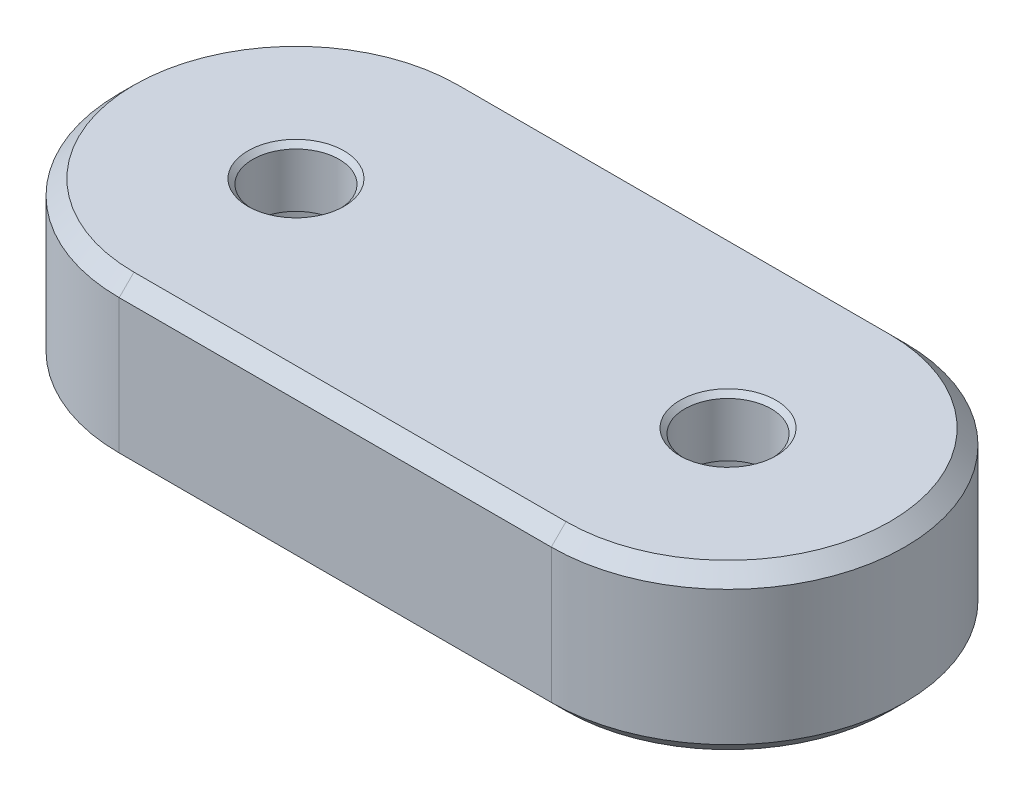
ISO-10303-21;
HEADER;
FILE_DESCRIPTION(('STEP AP214'),'2;1');
FILE_NAME('part.step','',(''),(''),'','','');
FILE_SCHEMA(('AUTOMOTIVE_DESIGN { 1 0 10303 214 1 1 1 1 }'));
ENDSEC;
DATA;
#1=APPLICATION_CONTEXT('core data for automotive mechanical design processes');
#2=APPLICATION_PROTOCOL_DEFINITION('international standard','automotive_design',2000,#1);
#3=PRODUCT_CONTEXT('',#1,'mechanical');
#4=PRODUCT('Part','Part','',(#3));
#5=PRODUCT_RELATED_PRODUCT_CATEGORY('part','',(#4));
#6=PRODUCT_DEFINITION_FORMATION('','',#4);
#7=PRODUCT_DEFINITION_CONTEXT('part definition',#1,'design');
#8=PRODUCT_DEFINITION('design','',#6,#7);
#9=PRODUCT_DEFINITION_SHAPE('','',#8);
#10=(LENGTH_UNIT() NAMED_UNIT(*) SI_UNIT(.MILLI.,.METRE.));
#11=(NAMED_UNIT(*) PLANE_ANGLE_UNIT() SI_UNIT($,.RADIAN.));
#12=(NAMED_UNIT(*) SI_UNIT($,.STERADIAN.) SOLID_ANGLE_UNIT());
#13=UNCERTAINTY_MEASURE_WITH_UNIT(LENGTH_MEASURE(1.E-05),#10,'distance_accuracy_value','');
#14=(GEOMETRIC_REPRESENTATION_CONTEXT(3) GLOBAL_UNCERTAINTY_ASSIGNED_CONTEXT((#13)) GLOBAL_UNIT_ASSIGNED_CONTEXT((#10,
#11,#12)) REPRESENTATION_CONTEXT('',''));
#15=CARTESIAN_POINT('',(0.,0.,0.));
#16=DIRECTION('',(0.,0.,1.));
#17=DIRECTION('',(1.,0.,0.));
#18=AXIS2_PLACEMENT_3D('',#15,#16,#17);
#19=CARTESIAN_POINT('',(0.,-5.35,9.));
#20=DIRECTION('',(0.,0.,1.));
#21=DIRECTION('',(1.,0.,0.));
#22=AXIS2_PLACEMENT_3D('',#19,#20,#21);
#23=PLANE('',#22);
#24=DIRECTION('',(0.,1.,0.));
#25=VECTOR('',#24,1.);
#26=CARTESIAN_POINT('',(0.,-5.35,9.));
#27=LINE('',#26,#25);
#28=CARTESIAN_POINT('',(0.,-4.59999999999999,9.));
#29=VERTEX_POINT('',#28);
#30=CARTESIAN_POINT('',(0.,2.24999999999999,9.));
#31=VERTEX_POINT('',#30);
#32=EDGE_CURVE('E135',#29,#31,#27,.T.);
#33=ORIENTED_EDGE('',*,*,#32,.F.);
#34=DIRECTION('',(1.,0.,0.));
#35=VECTOR('',#34,1.);
#36=CARTESIAN_POINT('',(22.,-4.59999999999999,9.));
#37=LINE('',#36,#35);
#38=CARTESIAN_POINT('',(22.,-4.59999999999999,9.));
#39=VERTEX_POINT('',#38);
#40=EDGE_CURVE('E265',#29,#39,#37,.T.);
#41=ORIENTED_EDGE('',*,*,#40,.T.);
#42=DIRECTION('',(0.,1.,0.));
#43=VECTOR('',#42,1.);
#44=CARTESIAN_POINT('',(22.,-5.35,9.));
#45=LINE('',#44,#43);
#46=CARTESIAN_POINT('',(22.,2.24999999999999,9.));
#47=VERTEX_POINT('',#46);
#48=EDGE_CURVE('E205',#39,#47,#45,.T.);
#49=ORIENTED_EDGE('',*,*,#48,.T.);
#50=DIRECTION('',(-1.,0.,0.));
#51=VECTOR('',#50,1.);
#52=CARTESIAN_POINT('',(0.,2.24999999999999,9.));
#53=LINE('',#52,#51);
#54=EDGE_CURVE('E262',#47,#31,#53,.T.);
#55=ORIENTED_EDGE('',*,*,#54,.T.);
#56=EDGE_LOOP('',(#33,#41,#49,#55));
#57=FACE_BOUND('',#56,.T.);
#58=ADVANCED_FACE('F43',(#57),#23,.T.);
#59=CARTESIAN_POINT('',(0.,-5.35,0.));
#60=DIRECTION('',(0.,1.,0.));
#61=DIRECTION('',(0.,0.,1.));
#62=AXIS2_PLACEMENT_3D('',#59,#60,#61);
#63=CYLINDRICAL_SURFACE('',#62,9.);
#64=DIRECTION('',(0.,1.,0.));
#65=VECTOR('',#64,1.);
#66=CARTESIAN_POINT('',(0.,-5.35,-9.));
#67=LINE('',#66,#65);
#68=CARTESIAN_POINT('',(0.,-4.59999999999999,-9.));
#69=VERTEX_POINT('',#68);
#70=CARTESIAN_POINT('',(0.,2.24999999999999,-9.));
#71=VERTEX_POINT('',#70);
#72=EDGE_CURVE('E212',#69,#71,#67,.T.);
#73=ORIENTED_EDGE('',*,*,#72,.F.);
#74=CARTESIAN_POINT('',(0.,-4.59999999999999,0.));
#75=DIRECTION('',(0.,1.,0.));
#76=DIRECTION('',(0.,0.,1.));
#77=AXIS2_PLACEMENT_3D('',#74,#75,#76);
#78=CIRCLE('',#77,9.);
#79=EDGE_CURVE('E254',#69,#29,#78,.T.);
#80=ORIENTED_EDGE('',*,*,#79,.T.);
#81=ORIENTED_EDGE('',*,*,#32,.T.);
#82=CARTESIAN_POINT('',(0.,2.24999999999999,0.));
#83=DIRECTION('',(0.,1.,0.));
#84=DIRECTION('',(0.,0.,1.));
#85=AXIS2_PLACEMENT_3D('',#82,#83,#84);
#86=CIRCLE('',#85,9.);
#87=EDGE_CURVE('E251',#31,#71,#86,.F.);
#88=ORIENTED_EDGE('',*,*,#87,.T.);
#89=EDGE_LOOP('',(#73,#80,#81,#88));
#90=FACE_BOUND('',#89,.T.);
#91=ADVANCED_FACE('F288',(#90),#63,.T.);
#92=CARTESIAN_POINT('',(0.,-5.35,-9.));
#93=DIRECTION('',(0.,0.,1.));
#94=DIRECTION('',(1.,0.,0.));
#95=AXIS2_PLACEMENT_3D('',#92,#93,#94);
#96=PLANE('',#95);
#97=DIRECTION('',(0.,1.,0.));
#98=VECTOR('',#97,1.);
#99=CARTESIAN_POINT('',(22.,-5.35,-9.));
#100=LINE('',#99,#98);
#101=CARTESIAN_POINT('',(22.,-4.59999999999999,-9.));
#102=VERTEX_POINT('',#101);
#103=CARTESIAN_POINT('',(22.,2.24999999999999,-9.));
#104=VERTEX_POINT('',#103);
#105=EDGE_CURVE('E216',#102,#104,#100,.T.);
#106=ORIENTED_EDGE('',*,*,#105,.F.);
#107=DIRECTION('',(-1.,0.,0.));
#108=VECTOR('',#107,1.);
#109=CARTESIAN_POINT('',(0.,-4.59999999999999,-9.));
#110=LINE('',#109,#108);
#111=EDGE_CURVE('E247',#102,#69,#110,.T.);
#112=ORIENTED_EDGE('',*,*,#111,.T.);
#113=ORIENTED_EDGE('',*,*,#72,.T.);
#114=DIRECTION('',(1.,0.,0.));
#115=VECTOR('',#114,1.);
#116=CARTESIAN_POINT('',(22.,2.24999999999999,-9.));
#117=LINE('',#116,#115);
#118=EDGE_CURVE('E243',#71,#104,#117,.T.);
#119=ORIENTED_EDGE('',*,*,#118,.T.);
#120=EDGE_LOOP('',(#106,#112,#113,#119));
#121=FACE_BOUND('',#120,.T.);
#122=ADVANCED_FACE('F286',(#121),#96,.F.);
#123=CARTESIAN_POINT('',(0.,-5.35,0.));
#124=DIRECTION('',(0.,1.,0.));
#125=DIRECTION('',(0.,0.,1.));
#126=AXIS2_PLACEMENT_3D('',#123,#124,#125);
#127=CYLINDRICAL_SURFACE('',#126,4.6);
#128=CARTESIAN_POINT('',(0.,-4.6,0.));
#129=DIRECTION('',(0.,1.,0.));
#130=DIRECTION('',(0.,0.,1.));
#131=AXIS2_PLACEMENT_3D('',#128,#129,#130);
#132=CIRCLE('',#131,4.6);
#133=CARTESIAN_POINT('',(0.,-4.6,4.6));
#134=VERTEX_POINT('',#133);
#135=EDGE_CURVE('E239',#134,#134,#132,.F.);
#136=ORIENTED_EDGE('',*,*,#135,.T.);
#137=EDGE_LOOP('',(#136));
#138=FACE_BOUND('',#137,.T.);
#139=CARTESIAN_POINT('',(0.,0.,0.));
#140=DIRECTION('',(0.,1.,0.));
#141=DIRECTION('',(0.,0.,1.));
#142=AXIS2_PLACEMENT_3D('',#139,#140,#141);
#143=CIRCLE('',#142,4.6);
#144=CARTESIAN_POINT('',(0.,0.,4.6));
#145=VERTEX_POINT('',#144);
#146=EDGE_CURVE('E198',#145,#145,#143,.T.);
#147=ORIENTED_EDGE('',*,*,#146,.T.);
#148=EDGE_LOOP('',(#147));
#149=FACE_BOUND('',#148,.T.);
#150=ADVANCED_FACE('F325',(#138,#149),#127,.F.);
#151=CARTESIAN_POINT('',(22.,-5.35,0.));
#152=DIRECTION('',(0.,1.,0.));
#153=DIRECTION('',(0.,0.,1.));
#154=AXIS2_PLACEMENT_3D('',#151,#152,#153);
#155=CYLINDRICAL_SURFACE('',#154,4.6);
#156=CARTESIAN_POINT('',(22.,-4.59999999999999,0.));
#157=DIRECTION('',(0.,1.,0.));
#158=DIRECTION('',(0.,0.,1.));
#159=AXIS2_PLACEMENT_3D('',#156,#157,#158);
#160=CIRCLE('',#159,4.6);
#161=CARTESIAN_POINT('',(22.,-4.59999999999999,4.6));
#162=VERTEX_POINT('',#161);
#163=EDGE_CURVE('E235',#162,#162,#160,.F.);
#164=ORIENTED_EDGE('',*,*,#163,.T.);
#165=EDGE_LOOP('',(#164));
#166=FACE_BOUND('',#165,.T.);
#167=CARTESIAN_POINT('',(22.,0.,0.));
#168=DIRECTION('',(0.,1.,0.));
#169=DIRECTION('',(0.,0.,1.));
#170=AXIS2_PLACEMENT_3D('',#167,#168,#169);
#171=CIRCLE('',#170,4.6);
#172=CARTESIAN_POINT('',(22.,0.,4.6));
#173=VERTEX_POINT('',#172);
#174=EDGE_CURVE('E201',#173,#173,#171,.T.);
#175=ORIENTED_EDGE('',*,*,#174,.T.);
#176=EDGE_LOOP('',(#175));
#177=FACE_BOUND('',#176,.T.);
#178=ADVANCED_FACE('F328',(#166,#177),#155,.F.);
#179=CARTESIAN_POINT('',(22.,-5.35,0.));
#180=DIRECTION('',(0.,1.,0.));
#181=DIRECTION('',(0.,0.,1.));
#182=AXIS2_PLACEMENT_3D('',#179,#180,#181);
#183=CYLINDRICAL_SURFACE('',#182,9.);
#184=ORIENTED_EDGE('',*,*,#48,.F.);
#185=CARTESIAN_POINT('',(22.,-4.59999999999999,0.));
#186=DIRECTION('',(0.,1.,0.));
#187=DIRECTION('',(0.,0.,1.));
#188=AXIS2_PLACEMENT_3D('',#185,#186,#187);
#189=CIRCLE('',#188,9.);
#190=EDGE_CURVE('E138',#39,#102,#189,.T.);
#191=ORIENTED_EDGE('',*,*,#190,.T.);
#192=ORIENTED_EDGE('',*,*,#105,.T.);
#193=CARTESIAN_POINT('',(22.,2.24999999999999,0.));
#194=DIRECTION('',(0.,1.,0.));
#195=DIRECTION('',(0.,0.,1.));
#196=AXIS2_PLACEMENT_3D('',#193,#194,#195);
#197=CIRCLE('',#196,9.);
#198=EDGE_CURVE('E257',#104,#47,#197,.F.);
#199=ORIENTED_EDGE('',*,*,#198,.T.);
#200=EDGE_LOOP('',(#184,#191,#192,#199));
#201=FACE_BOUND('',#200,.T.);
#202=ADVANCED_FACE('F298',(#201),#183,.T.);
#203=CARTESIAN_POINT('',(0.,-5.35,0.));
#204=DIRECTION('',(0.,1.,0.));
#205=DIRECTION('',(0.,0.,1.));
#206=AXIS2_PLACEMENT_3D('',#203,#204,#205);
#207=PLANE('',#206);
#208=CARTESIAN_POINT('',(22.,-5.35,0.));
#209=DIRECTION('',(0.,1.,0.));
#210=DIRECTION('',(0.,0.,1.));
#211=AXIS2_PLACEMENT_3D('',#208,#209,#210);
#212=CIRCLE('',#211,5.35);
#213=CARTESIAN_POINT('',(22.,-5.35,5.35));
#214=VERTEX_POINT('',#213);
#215=EDGE_CURVE('E231',#214,#214,#212,.T.);
#216=ORIENTED_EDGE('',*,*,#215,.T.);
#217=EDGE_LOOP('',(#216));
#218=FACE_BOUND('',#217,.T.);
#219=CARTESIAN_POINT('',(0.,-5.35,0.));
#220=DIRECTION('',(0.,1.,0.));
#221=DIRECTION('',(0.,0.,1.));
#222=AXIS2_PLACEMENT_3D('',#219,#220,#221);
#223=CIRCLE('',#222,5.35);
#224=CARTESIAN_POINT('',(0.,-5.35,5.35));
#225=VERTEX_POINT('',#224);
#226=EDGE_CURVE('E227',#225,#225,#223,.T.);
#227=ORIENTED_EDGE('',*,*,#226,.T.);
#228=EDGE_LOOP('',(#227));
#229=FACE_BOUND('',#228,.T.);
#230=CARTESIAN_POINT('',(0.,-5.35,0.));
#231=DIRECTION('',(0.,1.,0.));
#232=DIRECTION('',(0.,0.,1.));
#233=AXIS2_PLACEMENT_3D('',#230,#231,#232);
#234=CIRCLE('',#233,8.24999999999999);
#235=CARTESIAN_POINT('',(0.,-5.35,8.24999999999999));
#236=VERTEX_POINT('',#235);
#237=CARTESIAN_POINT('',(0.,-5.35,-8.24999999999999));
#238=VERTEX_POINT('',#237);
#239=EDGE_CURVE('E123',#236,#238,#234,.F.);
#240=ORIENTED_EDGE('',*,*,#239,.T.);
#241=DIRECTION('',(1.,0.,0.));
#242=VECTOR('',#241,1.);
#243=CARTESIAN_POINT('',(0.,-5.35,-8.24999999999999));
#244=LINE('',#243,#242);
#245=CARTESIAN_POINT('',(22.,-5.35,-8.24999999999999));
#246=VERTEX_POINT('',#245);
#247=EDGE_CURVE('E118',#238,#246,#244,.T.);
#248=ORIENTED_EDGE('',*,*,#247,.T.);
#249=CARTESIAN_POINT('',(22.,-5.35,0.));
#250=DIRECTION('',(0.,1.,0.));
#251=DIRECTION('',(0.,0.,1.));
#252=AXIS2_PLACEMENT_3D('',#249,#250,#251);
#253=CIRCLE('',#252,8.24999999999999);
#254=CARTESIAN_POINT('',(22.,-5.35,8.24999999999999));
#255=VERTEX_POINT('',#254);
#256=EDGE_CURVE('E112',#246,#255,#253,.F.);
#257=ORIENTED_EDGE('',*,*,#256,.T.);
#258=DIRECTION('',(-1.,0.,0.));
#259=VECTOR('',#258,1.);
#260=CARTESIAN_POINT('',(0.,-5.35,8.24999999999999));
#261=LINE('',#260,#259);
#262=EDGE_CURVE('E115',#255,#236,#261,.T.);
#263=ORIENTED_EDGE('',*,*,#262,.T.);
#264=EDGE_LOOP('',(#240,#248,#257,#263));
#265=FACE_BOUND('',#264,.T.);
#266=ADVANCED_FACE('F114',(#218,#229,#265),#207,.F.);
#267=CARTESIAN_POINT('',(0.,0.,0.));
#268=DIRECTION('',(0.,1.,0.));
#269=DIRECTION('',(0.,0.,1.));
#270=AXIS2_PLACEMENT_3D('',#267,#268,#269);
#271=PLANE('',#270);
#272=CARTESIAN_POINT('',(22.,0.,0.));
#273=DIRECTION('',(0.,1.,0.));
#274=DIRECTION('',(0.,0.,1.));
#275=AXIS2_PLACEMENT_3D('',#272,#273,#274);
#276=CIRCLE('',#275,2.19999999999999);
#277=CARTESIAN_POINT('',(22.,0.,2.19999999999999));
#278=VERTEX_POINT('',#277);
#279=EDGE_CURVE('E144',#278,#278,#276,.T.);
#280=ORIENTED_EDGE('',*,*,#279,.T.);
#281=EDGE_LOOP('',(#280));
#282=FACE_BOUND('',#281,.T.);
#283=ORIENTED_EDGE('',*,*,#174,.F.);
#284=EDGE_LOOP('',(#283));
#285=FACE_BOUND('',#284,.T.);
#286=ADVANCED_FACE('F457',(#282,#285),#271,.F.);
#287=CARTESIAN_POINT('',(0.,0.,0.));
#288=DIRECTION('',(0.,1.,0.));
#289=DIRECTION('',(0.,0.,1.));
#290=AXIS2_PLACEMENT_3D('',#287,#288,#289);
#291=CIRCLE('',#290,2.2);
#292=CARTESIAN_POINT('',(0.,0.,2.2));
#293=VERTEX_POINT('',#292);
#294=EDGE_CURVE('E194',#293,#293,#291,.T.);
#295=ORIENTED_EDGE('',*,*,#294,.T.);
#296=EDGE_LOOP('',(#295));
#297=FACE_BOUND('',#296,.T.);
#298=ORIENTED_EDGE('',*,*,#146,.F.);
#299=EDGE_LOOP('',(#298));
#300=FACE_BOUND('',#299,.T.);
#301=ADVANCED_FACE('F188',(#297,#300),#271,.F.);
#302=CARTESIAN_POINT('',(22.,3.,0.));
#303=DIRECTION('',(0.,-1.,0.));
#304=DIRECTION('',(0.,0.,-1.));
#305=AXIS2_PLACEMENT_3D('',#302,#303,#304);
#306=CYLINDRICAL_SURFACE('',#305,2.19999999999999);
#307=CARTESIAN_POINT('',(22.,2.75000000000001,0.));
#308=DIRECTION('',(0.,1.,0.));
#309=DIRECTION('',(0.,0.,1.));
#310=AXIS2_PLACEMENT_3D('',#307,#308,#309);
#311=CIRCLE('',#310,2.19999999999999);
#312=CARTESIAN_POINT('',(22.,2.75000000000001,2.19999999999999));
#313=VERTEX_POINT('',#312);
#314=EDGE_CURVE('E163',#313,#313,#311,.T.);
#315=ORIENTED_EDGE('',*,*,#314,.T.);
#316=EDGE_LOOP('',(#315));
#317=FACE_BOUND('',#316,.T.);
#318=ORIENTED_EDGE('',*,*,#279,.F.);
#319=EDGE_LOOP('',(#318));
#320=FACE_BOUND('',#319,.T.);
#321=ADVANCED_FACE('F184',(#317,#320),#306,.F.);
#322=CARTESIAN_POINT('',(0.,3.,0.));
#323=DIRECTION('',(0.,-1.,0.));
#324=DIRECTION('',(0.,0.,-1.));
#325=AXIS2_PLACEMENT_3D('',#322,#323,#324);
#326=CYLINDRICAL_SURFACE('',#325,2.2);
#327=CARTESIAN_POINT('',(0.,2.75,0.));
#328=DIRECTION('',(0.,1.,0.));
#329=DIRECTION('',(0.,0.,1.));
#330=AXIS2_PLACEMENT_3D('',#327,#328,#329);
#331=CIRCLE('',#330,2.2);
#332=CARTESIAN_POINT('',(0.,2.75,2.2));
#333=VERTEX_POINT('',#332);
#334=EDGE_CURVE('E11',#333,#333,#331,.T.);
#335=ORIENTED_EDGE('',*,*,#334,.T.);
#336=EDGE_LOOP('',(#335));
#337=FACE_BOUND('',#336,.T.);
#338=ORIENTED_EDGE('',*,*,#294,.F.);
#339=EDGE_LOOP('',(#338));
#340=FACE_BOUND('',#339,.T.);
#341=ADVANCED_FACE('F187',(#337,#340),#326,.F.);
#342=CARTESIAN_POINT('',(0.,3.,0.));
#343=DIRECTION('',(0.,1.,0.));
#344=DIRECTION('',(0.,0.,1.));
#345=AXIS2_PLACEMENT_3D('',#342,#343,#344);
#346=PLANE('',#345);
#347=CARTESIAN_POINT('',(22.,3.,0.));
#348=DIRECTION('',(0.,1.,0.));
#349=DIRECTION('',(0.,0.,1.));
#350=AXIS2_PLACEMENT_3D('',#347,#348,#349);
#351=CIRCLE('',#350,2.44999999999999);
#352=CARTESIAN_POINT('',(22.,3.,2.44999999999999));
#353=VERTEX_POINT('',#352);
#354=EDGE_CURVE('E53',#353,#353,#351,.F.);
#355=ORIENTED_EDGE('',*,*,#354,.T.);
#356=EDGE_LOOP('',(#355));
#357=FACE_BOUND('',#356,.T.);
#358=CARTESIAN_POINT('',(0.,3.,0.));
#359=DIRECTION('',(0.,1.,0.));
#360=DIRECTION('',(0.,0.,1.));
#361=AXIS2_PLACEMENT_3D('',#358,#359,#360);
#362=CIRCLE('',#361,2.45);
#363=CARTESIAN_POINT('',(0.,3.,2.45));
#364=VERTEX_POINT('',#363);
#365=EDGE_CURVE('E167',#364,#364,#362,.F.);
#366=ORIENTED_EDGE('',*,*,#365,.T.);
#367=EDGE_LOOP('',(#366));
#368=FACE_BOUND('',#367,.T.);
#369=CARTESIAN_POINT('',(22.,3.,0.));
#370=DIRECTION('',(0.,1.,0.));
#371=DIRECTION('',(0.,0.,1.));
#372=AXIS2_PLACEMENT_3D('',#369,#370,#371);
#373=CIRCLE('',#372,8.24999999999999);
#374=CARTESIAN_POINT('',(22.,3.,8.24999999999999));
#375=VERTEX_POINT('',#374);
#376=CARTESIAN_POINT('',(22.,3.,-8.24999999999999));
#377=VERTEX_POINT('',#376);
#378=EDGE_CURVE('E68',#375,#377,#373,.T.);
#379=ORIENTED_EDGE('',*,*,#378,.T.);
#380=DIRECTION('',(-1.,0.,0.));
#381=VECTOR('',#380,1.);
#382=CARTESIAN_POINT('',(0.,3.,-8.24999999999999));
#383=LINE('',#382,#381);
#384=CARTESIAN_POINT('',(0.,3.,-8.24999999999999));
#385=VERTEX_POINT('',#384);
#386=EDGE_CURVE('E168',#377,#385,#383,.T.);
#387=ORIENTED_EDGE('',*,*,#386,.T.);
#388=CARTESIAN_POINT('',(0.,3.,0.));
#389=DIRECTION('',(0.,1.,0.));
#390=DIRECTION('',(0.,0.,1.));
#391=AXIS2_PLACEMENT_3D('',#388,#389,#390);
#392=CIRCLE('',#391,8.24999999999999);
#393=CARTESIAN_POINT('',(0.,3.,8.24999999999999));
#394=VERTEX_POINT('',#393);
#395=EDGE_CURVE('E273',#385,#394,#392,.T.);
#396=ORIENTED_EDGE('',*,*,#395,.T.);
#397=DIRECTION('',(1.,0.,0.));
#398=VECTOR('',#397,1.);
#399=CARTESIAN_POINT('',(0.,3.,8.24999999999999));
#400=LINE('',#399,#398);
#401=EDGE_CURVE('E268',#394,#375,#400,.T.);
#402=ORIENTED_EDGE('',*,*,#401,.T.);
#403=EDGE_LOOP('',(#379,#387,#396,#402));
#404=FACE_BOUND('',#403,.T.);
#405=ADVANCED_FACE('F175',(#357,#368,#404),#346,.T.);
#406=CARTESIAN_POINT('',(22.,-5.35,0.));
#407=DIRECTION('',(0.,-1.,0.));
#408=DIRECTION('',(0.,0.,-1.));
#409=AXIS2_PLACEMENT_3D('',#406,#407,#408);
#410=CONICAL_SURFACE('',#409,5.35,0.785398163397447);
#411=ORIENTED_EDGE('',*,*,#163,.F.);
#412=EDGE_LOOP('',(#411));
#413=FACE_BOUND('',#412,.T.);
#414=ORIENTED_EDGE('',*,*,#215,.F.);
#415=EDGE_LOOP('',(#414));
#416=FACE_BOUND('',#415,.T.);
#417=ADVANCED_FACE('F334',(#413,#416),#410,.F.);
#418=CARTESIAN_POINT('',(0.,-5.35,0.));
#419=DIRECTION('',(0.,-1.,0.));
#420=DIRECTION('',(0.,0.,-1.));
#421=AXIS2_PLACEMENT_3D('',#418,#419,#420);
#422=CONICAL_SURFACE('',#421,5.35,0.785398163397447);
#423=ORIENTED_EDGE('',*,*,#135,.F.);
#424=EDGE_LOOP('',(#423));
#425=FACE_BOUND('',#424,.T.);
#426=ORIENTED_EDGE('',*,*,#226,.F.);
#427=EDGE_LOOP('',(#426));
#428=FACE_BOUND('',#427,.T.);
#429=ADVANCED_FACE('F340',(#425,#428),#422,.F.);
#430=CARTESIAN_POINT('',(0.,-4.59999999999999,9.));
#431=DIRECTION('',(0.,-0.707106781186547,0.707106781186547));
#432=DIRECTION('',(-1.,0.,0.));
#433=AXIS2_PLACEMENT_3D('',#430,#431,#432);
#434=PLANE('',#433);
#435=DIRECTION('',(0.,-0.707106781186547,-0.707106781186547));
#436=VECTOR('',#435,1.);
#437=CARTESIAN_POINT('',(22.,-4.59999999999999,9.));
#438=LINE('',#437,#436);
#439=EDGE_CURVE('E129',#39,#255,#438,.T.);
#440=ORIENTED_EDGE('',*,*,#439,.F.);
#441=ORIENTED_EDGE('',*,*,#40,.F.);
#442=DIRECTION('',(0.,0.707106781186547,0.707106781186547));
#443=VECTOR('',#442,1.);
#444=CARTESIAN_POINT('',(0.,-5.35,8.24999999999999));
#445=LINE('',#444,#443);
#446=EDGE_CURVE('E132',#236,#29,#445,.T.);
#447=ORIENTED_EDGE('',*,*,#446,.F.);
#448=ORIENTED_EDGE('',*,*,#262,.F.);
#449=EDGE_LOOP('',(#440,#441,#447,#448));
#450=FACE_BOUND('',#449,.T.);
#451=ADVANCED_FACE('F127',(#450),#434,.T.);
#452=CARTESIAN_POINT('',(0.,-4.59999999999999,0.));
#453=DIRECTION('',(0.,1.,0.));
#454=DIRECTION('',(0.,0.,1.));
#455=AXIS2_PLACEMENT_3D('',#452,#453,#454);
#456=CONICAL_SURFACE('',#455,9.,0.785398163397448);
#457=ORIENTED_EDGE('',*,*,#446,.T.);
#458=ORIENTED_EDGE('',*,*,#79,.F.);
#459=DIRECTION('',(0.,0.707106781186547,-0.707106781186547));
#460=VECTOR('',#459,1.);
#461=CARTESIAN_POINT('',(0.,-5.35,-8.24999999999999));
#462=LINE('',#461,#460);
#463=EDGE_CURVE('E140',#238,#69,#462,.T.);
#464=ORIENTED_EDGE('',*,*,#463,.F.);
#465=ORIENTED_EDGE('',*,*,#239,.F.);
#466=EDGE_LOOP('',(#457,#458,#464,#465));
#467=FACE_BOUND('',#466,.T.);
#468=ADVANCED_FACE('F360',(#467),#456,.T.);
#469=CARTESIAN_POINT('',(22.,-4.59999999999999,0.));
#470=DIRECTION('',(0.,1.,0.));
#471=DIRECTION('',(0.,0.,1.));
#472=AXIS2_PLACEMENT_3D('',#469,#470,#471);
#473=CONICAL_SURFACE('',#472,9.,0.785398163397448);
#474=ORIENTED_EDGE('',*,*,#439,.T.);
#475=ORIENTED_EDGE('',*,*,#256,.F.);
#476=DIRECTION('',(0.,-0.707106781186547,0.707106781186547));
#477=VECTOR('',#476,1.);
#478=CARTESIAN_POINT('',(22.,-4.59999999999999,-9.));
#479=LINE('',#478,#477);
#480=EDGE_CURVE('E146',#102,#246,#479,.T.);
#481=ORIENTED_EDGE('',*,*,#480,.F.);
#482=ORIENTED_EDGE('',*,*,#190,.F.);
#483=EDGE_LOOP('',(#474,#475,#481,#482));
#484=FACE_BOUND('',#483,.T.);
#485=ADVANCED_FACE('F137',(#484),#473,.T.);
#486=CARTESIAN_POINT('',(0.,-5.35,-8.24999999999999));
#487=DIRECTION('',(0.,0.707106781186547,0.707106781186547));
#488=DIRECTION('',(1.,0.,0.));
#489=AXIS2_PLACEMENT_3D('',#486,#487,#488);
#490=PLANE('',#489);
#491=ORIENTED_EDGE('',*,*,#463,.T.);
#492=ORIENTED_EDGE('',*,*,#111,.F.);
#493=ORIENTED_EDGE('',*,*,#480,.T.);
#494=ORIENTED_EDGE('',*,*,#247,.F.);
#495=EDGE_LOOP('',(#491,#492,#493,#494));
#496=FACE_BOUND('',#495,.T.);
#497=ADVANCED_FACE('F280',(#496),#490,.F.);
#498=CARTESIAN_POINT('',(0.,3.,8.24999999999999));
#499=DIRECTION('',(0.,-0.707106781186547,-0.707106781186547));
#500=DIRECTION('',(1.,0.,0.));
#501=AXIS2_PLACEMENT_3D('',#498,#499,#500);
#502=PLANE('',#501);
#503=DIRECTION('',(0.,-0.707106781186547,0.707106781186547));
#504=VECTOR('',#503,1.);
#505=CARTESIAN_POINT('',(22.,3.,8.24999999999999));
#506=LINE('',#505,#504);
#507=EDGE_CURVE('E155',#375,#47,#506,.T.);
#508=ORIENTED_EDGE('',*,*,#507,.F.);
#509=ORIENTED_EDGE('',*,*,#401,.F.);
#510=DIRECTION('',(0.,0.707106781186547,-0.707106781186547));
#511=VECTOR('',#510,1.);
#512=CARTESIAN_POINT('',(0.,2.24999999999999,9.));
#513=LINE('',#512,#511);
#514=EDGE_CURVE('E159',#31,#394,#513,.T.);
#515=ORIENTED_EDGE('',*,*,#514,.F.);
#516=ORIENTED_EDGE('',*,*,#54,.F.);
#517=EDGE_LOOP('',(#508,#509,#515,#516));
#518=FACE_BOUND('',#517,.T.);
#519=ADVANCED_FACE('F303',(#518),#502,.F.);
#520=CARTESIAN_POINT('',(0.,3.,0.));
#521=DIRECTION('',(0.,-1.,0.));
#522=DIRECTION('',(0.,0.,-1.));
#523=AXIS2_PLACEMENT_3D('',#520,#521,#522);
#524=CONICAL_SURFACE('',#523,8.24999999999999,0.785398163397448);
#525=ORIENTED_EDGE('',*,*,#514,.T.);
#526=ORIENTED_EDGE('',*,*,#395,.F.);
#527=DIRECTION('',(0.,0.707106781186547,0.707106781186547));
#528=VECTOR('',#527,1.);
#529=CARTESIAN_POINT('',(0.,2.24999999999999,-9.));
#530=LINE('',#529,#528);
#531=EDGE_CURVE('E60',#71,#385,#530,.T.);
#532=ORIENTED_EDGE('',*,*,#531,.F.);
#533=ORIENTED_EDGE('',*,*,#87,.F.);
#534=EDGE_LOOP('',(#525,#526,#532,#533));
#535=FACE_BOUND('',#534,.T.);
#536=ADVANCED_FACE('F293',(#535),#524,.T.);
#537=CARTESIAN_POINT('',(22.,3.,0.));
#538=DIRECTION('',(0.,-1.,0.));
#539=DIRECTION('',(0.,0.,-1.));
#540=AXIS2_PLACEMENT_3D('',#537,#538,#539);
#541=CONICAL_SURFACE('',#540,8.24999999999999,0.785398163397448);
#542=ORIENTED_EDGE('',*,*,#507,.T.);
#543=ORIENTED_EDGE('',*,*,#198,.F.);
#544=DIRECTION('',(0.,-0.707106781186547,-0.707106781186547));
#545=VECTOR('',#544,1.);
#546=CARTESIAN_POINT('',(22.,3.,-8.24999999999999));
#547=LINE('',#546,#545);
#548=EDGE_CURVE('E150',#377,#104,#547,.T.);
#549=ORIENTED_EDGE('',*,*,#548,.F.);
#550=ORIENTED_EDGE('',*,*,#378,.F.);
#551=EDGE_LOOP('',(#542,#543,#549,#550));
#552=FACE_BOUND('',#551,.T.);
#553=ADVANCED_FACE('F306',(#552),#541,.T.);
#554=CARTESIAN_POINT('',(0.,2.24999999999999,-9.));
#555=DIRECTION('',(0.,0.707106781186547,-0.707106781186547));
#556=DIRECTION('',(-1.,0.,0.));
#557=AXIS2_PLACEMENT_3D('',#554,#555,#556);
#558=PLANE('',#557);
#559=ORIENTED_EDGE('',*,*,#531,.T.);
#560=ORIENTED_EDGE('',*,*,#386,.F.);
#561=ORIENTED_EDGE('',*,*,#548,.T.);
#562=ORIENTED_EDGE('',*,*,#118,.F.);
#563=EDGE_LOOP('',(#559,#560,#561,#562));
#564=FACE_BOUND('',#563,.T.);
#565=ADVANCED_FACE('F181',(#564),#558,.T.);
#566=CARTESIAN_POINT('',(22.,2.75000000000001,0.));
#567=DIRECTION('',(0.,1.,0.));
#568=DIRECTION('',(0.,0.,1.));
#569=AXIS2_PLACEMENT_3D('',#566,#567,#568);
#570=CONICAL_SURFACE('',#569,2.19999999999999,0.785398163397447);
#571=ORIENTED_EDGE('',*,*,#354,.F.);
#572=EDGE_LOOP('',(#571));
#573=FACE_BOUND('',#572,.T.);
#574=ORIENTED_EDGE('',*,*,#314,.F.);
#575=EDGE_LOOP('',(#574));
#576=FACE_BOUND('',#575,.T.);
#577=ADVANCED_FACE('F178',(#573,#576),#570,.F.);
#578=CARTESIAN_POINT('',(0.,2.75,0.));
#579=DIRECTION('',(0.,1.,0.));
#580=DIRECTION('',(0.,0.,1.));
#581=AXIS2_PLACEMENT_3D('',#578,#579,#580);
#582=CONICAL_SURFACE('',#581,2.2,0.785398163397447);
#583=ORIENTED_EDGE('',*,*,#365,.F.);
#584=EDGE_LOOP('',(#583));
#585=FACE_BOUND('',#584,.T.);
#586=ORIENTED_EDGE('',*,*,#334,.F.);
#587=EDGE_LOOP('',(#586));
#588=FACE_BOUND('',#587,.T.);
#589=ADVANCED_FACE('F46',(#585,#588),#582,.F.);
#590=CLOSED_SHELL('',(#58,#91,#122,#150,#178,#202,#266,#286,#301,#321,#341,#405,#417,#429,#451,
#468,#485,#497,#519,#536,#553,#565,#577,#589));
#591=MANIFOLD_SOLID_BREP('B2',#590);
#592=ADVANCED_BREP_SHAPE_REPRESENTATION('',(#18,#591),#14);
#593=SHAPE_DEFINITION_REPRESENTATION(#9,#592);
ENDSEC;
END-ISO-10303-21;
